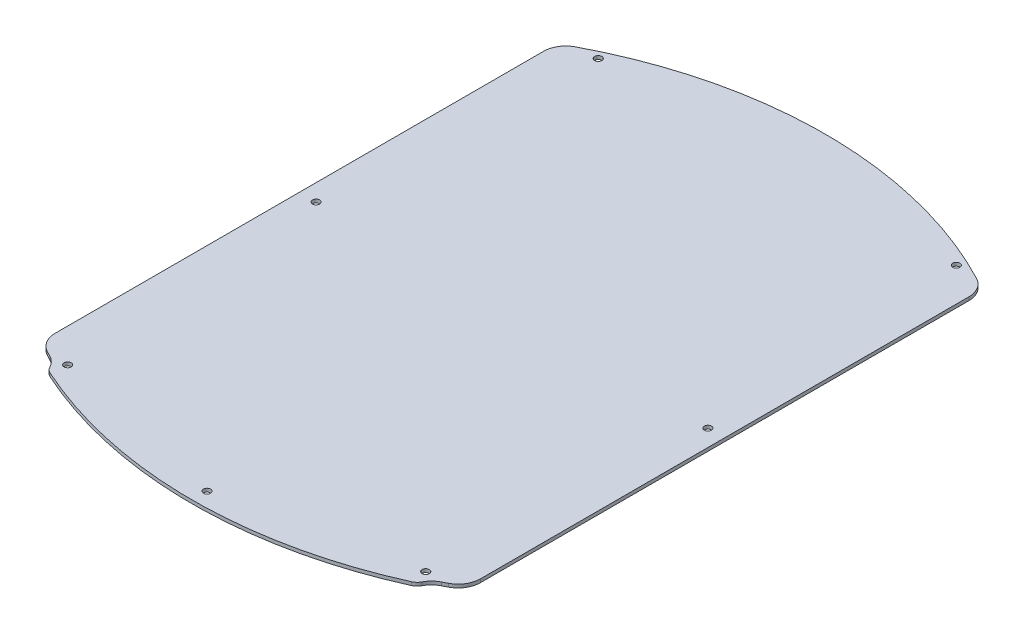
ISO-10303-21;
HEADER;
FILE_DESCRIPTION(('STEP AP214'),'2;1');
FILE_NAME('part.step','',(''),(''),'','','');
FILE_SCHEMA(('AUTOMOTIVE_DESIGN { 1 0 10303 214 1 1 1 1 }'));
ENDSEC;
DATA;
#1=APPLICATION_CONTEXT('core data for automotive mechanical design processes');
#2=APPLICATION_PROTOCOL_DEFINITION('international standard','automotive_design',2000,#1);
#3=PRODUCT_CONTEXT('',#1,'mechanical');
#4=PRODUCT('Part','Part','',(#3));
#5=PRODUCT_RELATED_PRODUCT_CATEGORY('part','',(#4));
#6=PRODUCT_DEFINITION_FORMATION('','',#4);
#7=PRODUCT_DEFINITION_CONTEXT('part definition',#1,'design');
#8=PRODUCT_DEFINITION('design','',#6,#7);
#9=PRODUCT_DEFINITION_SHAPE('','',#8);
#10=(LENGTH_UNIT() NAMED_UNIT(*) SI_UNIT(.MILLI.,.METRE.));
#11=(NAMED_UNIT(*) PLANE_ANGLE_UNIT() SI_UNIT($,.RADIAN.));
#12=(NAMED_UNIT(*) SI_UNIT($,.STERADIAN.) SOLID_ANGLE_UNIT());
#13=UNCERTAINTY_MEASURE_WITH_UNIT(LENGTH_MEASURE(1.E-05),#10,'distance_accuracy_value','');
#14=(GEOMETRIC_REPRESENTATION_CONTEXT(3) GLOBAL_UNCERTAINTY_ASSIGNED_CONTEXT((#13)) GLOBAL_UNIT_ASSIGNED_CONTEXT((#10,
#11,#12)) REPRESENTATION_CONTEXT('',''));
#15=CARTESIAN_POINT('',(0.,0.,0.));
#16=DIRECTION('',(0.,0.,1.));
#17=DIRECTION('',(1.,0.,0.));
#18=AXIS2_PLACEMENT_3D('',#15,#16,#17);
#19=CARTESIAN_POINT('',(0.,-1.5,-52.9999999999993));
#20=DIRECTION('',(0.,1.,0.));
#21=DIRECTION('',(0.,0.,1.));
#22=AXIS2_PLACEMENT_3D('',#19,#20,#21);
#23=CYLINDRICAL_SURFACE('',#22,193.);
#24=CARTESIAN_POINT('',(0.,-1.5,-52.9999999999993));
#25=DIRECTION('',(0.,1.,0.));
#26=DIRECTION('',(0.,0.,1.));
#27=AXIS2_PLACEMENT_3D('',#24,#25,#26);
#28=CIRCLE('',#27,193.);
#29=CARTESIAN_POINT('',(-89.6448087431694,-1.5,117.917548149395));
#30=VERTEX_POINT('',#29);
#31=CARTESIAN_POINT('',(-87.4520577175171,-1.5,119.049811394759));
#32=VERTEX_POINT('',#31);
#33=EDGE_CURVE('E182',#30,#32,#28,.T.);
#34=ORIENTED_EDGE('',*,*,#33,.T.);
#35=DIRECTION('',(0.,1.,0.));
#36=VECTOR('',#35,1.);
#37=CARTESIAN_POINT('',(-87.4520577175171,-1.5,119.049811394759));
#38=LINE('',#37,#36);
#39=CARTESIAN_POINT('',(-87.4520577175171,0.,119.049811394759));
#40=VERTEX_POINT('',#39);
#41=EDGE_CURVE('E208',#32,#40,#38,.T.);
#42=ORIENTED_EDGE('',*,*,#41,.T.);
#43=CARTESIAN_POINT('',(0.,0.,-52.9999999999993));
#44=DIRECTION('',(0.,1.,0.));
#45=DIRECTION('',(0.,0.,1.));
#46=AXIS2_PLACEMENT_3D('',#43,#44,#45);
#47=CIRCLE('',#46,193.);
#48=CARTESIAN_POINT('',(-89.6448087431694,0.,117.917548149395));
#49=VERTEX_POINT('',#48);
#50=EDGE_CURVE('E269',#49,#40,#47,.T.);
#51=ORIENTED_EDGE('',*,*,#50,.F.);
#52=DIRECTION('',(0.,1.,0.));
#53=VECTOR('',#52,1.);
#54=CARTESIAN_POINT('',(-89.6448087431694,-1.5,117.917548149395));
#55=LINE('',#54,#53);
#56=EDGE_CURVE('E206',#49,#30,#55,.F.);
#57=ORIENTED_EDGE('',*,*,#56,.T.);
#58=EDGE_LOOP('',(#34,#42,#51,#57));
#59=FACE_BOUND('',#58,.T.);
#60=ADVANCED_FACE('F45',(#59),#23,.T.);
#61=CARTESIAN_POINT('',(0.,-1.5,53.0000000000004));
#62=DIRECTION('',(0.,1.,0.));
#63=DIRECTION('',(0.,0.,1.));
#64=AXIS2_PLACEMENT_3D('',#61,#62,#63);
#65=CYLINDRICAL_SURFACE('',#64,193.);
#66=CARTESIAN_POINT('',(0.,-1.5,53.0000000000004));
#67=DIRECTION('',(0.,1.,0.));
#68=DIRECTION('',(0.,0.,-1.));
#69=AXIS2_PLACEMENT_3D('',#66,#67,#68);
#70=CIRCLE('',#69,193.);
#71=CARTESIAN_POINT('',(89.6448087431693,-1.5,-117.917548149394));
#72=VERTEX_POINT('',#71);
#73=CARTESIAN_POINT('',(-89.6448087431694,-1.5,-117.917548149394));
#74=VERTEX_POINT('',#73);
#75=EDGE_CURVE('E264',#72,#74,#70,.T.);
#76=ORIENTED_EDGE('',*,*,#75,.T.);
#77=DIRECTION('',(0.,1.,0.));
#78=VECTOR('',#77,1.);
#79=CARTESIAN_POINT('',(-89.6448087431695,-1.5,-117.917548149394));
#80=LINE('',#79,#78);
#81=CARTESIAN_POINT('',(-89.6448087431694,0.,-117.917548149394));
#82=VERTEX_POINT('',#81);
#83=EDGE_CURVE('E170',#74,#82,#80,.T.);
#84=ORIENTED_EDGE('',*,*,#83,.T.);
#85=CARTESIAN_POINT('',(0.,0.,53.0000000000004));
#86=DIRECTION('',(0.,1.,0.));
#87=DIRECTION('',(0.,0.,-1.));
#88=AXIS2_PLACEMENT_3D('',#85,#86,#87);
#89=CIRCLE('',#88,193.);
#90=CARTESIAN_POINT('',(89.6448087431693,0.,-117.917548149394));
#91=VERTEX_POINT('',#90);
#92=EDGE_CURVE('E153',#91,#82,#89,.T.);
#93=ORIENTED_EDGE('',*,*,#92,.F.);
#94=DIRECTION('',(0.,1.,0.));
#95=VECTOR('',#94,1.);
#96=CARTESIAN_POINT('',(89.6448087431694,-1.5,-117.917548149394));
#97=LINE('',#96,#95);
#98=EDGE_CURVE('E167',#91,#72,#97,.F.);
#99=ORIENTED_EDGE('',*,*,#98,.T.);
#100=EDGE_LOOP('',(#76,#84,#93,#99));
#101=FACE_BOUND('',#100,.T.);
#102=ADVANCED_FACE('F166',(#101),#65,.T.);
#103=CARTESIAN_POINT('',(95.,-1.5,115.));
#104=DIRECTION('',(1.,0.,0.));
#105=DIRECTION('',(0.,0.,-1.));
#106=AXIS2_PLACEMENT_3D('',#103,#104,#105);
#107=PLANE('',#106);
#108=DIRECTION('',(0.,0.,-1.));
#109=VECTOR('',#108,1.);
#110=CARTESIAN_POINT('',(95.,-1.5,115.));
#111=LINE('',#110,#109);
#112=CARTESIAN_POINT('',(95.,-1.5,109.061716639064));
#113=VERTEX_POINT('',#112);
#114=CARTESIAN_POINT('',(95.,-1.5,-109.061716639063));
#115=VERTEX_POINT('',#114);
#116=EDGE_CURVE('E177',#113,#115,#111,.T.);
#117=ORIENTED_EDGE('',*,*,#116,.T.);
#118=DIRECTION('',(0.,1.,0.));
#119=VECTOR('',#118,1.);
#120=CARTESIAN_POINT('',(95.,-1.5,-109.061716639063));
#121=LINE('',#120,#119);
#122=CARTESIAN_POINT('',(95.,0.,-109.061716639063));
#123=VERTEX_POINT('',#122);
#124=EDGE_CURVE('E204',#115,#123,#121,.T.);
#125=ORIENTED_EDGE('',*,*,#124,.T.);
#126=DIRECTION('',(0.,0.,-1.));
#127=VECTOR('',#126,1.);
#128=CARTESIAN_POINT('',(95.,0.,115.));
#129=LINE('',#128,#127);
#130=CARTESIAN_POINT('',(95.,0.,109.061716639064));
#131=VERTEX_POINT('',#130);
#132=EDGE_CURVE('E155',#131,#123,#129,.T.);
#133=ORIENTED_EDGE('',*,*,#132,.F.);
#134=DIRECTION('',(0.,1.,0.));
#135=VECTOR('',#134,1.);
#136=CARTESIAN_POINT('',(95.,-1.5,109.061716639064));
#137=LINE('',#136,#135);
#138=EDGE_CURVE('E202',#131,#113,#137,.F.);
#139=ORIENTED_EDGE('',*,*,#138,.T.);
#140=EDGE_LOOP('',(#117,#125,#133,#139));
#141=FACE_BOUND('',#140,.T.);
#142=ADVANCED_FACE('F348',(#141),#107,.T.);
#143=CARTESIAN_POINT('',(87.4520577175173,0.,119.049811394759));
#144=VERTEX_POINT('',#143);
#145=CARTESIAN_POINT('',(89.6448087431694,0.,117.917548149395));
#146=VERTEX_POINT('',#145);
#147=EDGE_CURVE('E257',#144,#146,#47,.T.);
#148=ORIENTED_EDGE('',*,*,#147,.F.);
#149=DIRECTION('',(0.,1.,0.));
#150=VECTOR('',#149,1.);
#151=CARTESIAN_POINT('',(87.4520577175173,-1.5,119.049811394759));
#152=LINE('',#151,#150);
#153=CARTESIAN_POINT('',(87.4520577175173,-1.5,119.049811394759));
#154=VERTEX_POINT('',#153);
#155=EDGE_CURVE('E214',#144,#154,#152,.F.);
#156=ORIENTED_EDGE('',*,*,#155,.T.);
#157=CARTESIAN_POINT('',(89.6448087431694,-1.5,117.917548149395));
#158=VERTEX_POINT('',#157);
#159=EDGE_CURVE('E255',#154,#158,#28,.T.);
#160=ORIENTED_EDGE('',*,*,#159,.T.);
#161=DIRECTION('',(0.,1.,0.));
#162=VECTOR('',#161,1.);
#163=CARTESIAN_POINT('',(89.6448087431694,-1.5,117.917548149395));
#164=LINE('',#163,#162);
#165=EDGE_CURVE('E211',#158,#146,#164,.T.);
#166=ORIENTED_EDGE('',*,*,#165,.T.);
#167=EDGE_LOOP('',(#148,#156,#160,#166));
#168=FACE_BOUND('',#167,.T.);
#169=ADVANCED_FACE('F254',(#168),#23,.T.);
#170=CARTESIAN_POINT('',(-95.,-1.5,115.));
#171=DIRECTION('',(-1.,0.,0.));
#172=DIRECTION('',(0.,0.,1.));
#173=AXIS2_PLACEMENT_3D('',#170,#171,#172);
#174=PLANE('',#173);
#175=DIRECTION('',(0.,0.,1.));
#176=VECTOR('',#175,1.);
#177=CARTESIAN_POINT('',(-95.,0.,115.));
#178=LINE('',#177,#176);
#179=CARTESIAN_POINT('',(-95.,0.,-109.061716639063));
#180=VERTEX_POINT('',#179);
#181=CARTESIAN_POINT('',(-95.,0.,109.061716639064));
#182=VERTEX_POINT('',#181);
#183=EDGE_CURVE('E171',#180,#182,#178,.T.);
#184=ORIENTED_EDGE('',*,*,#183,.F.);
#185=DIRECTION('',(0.,1.,0.));
#186=VECTOR('',#185,1.);
#187=CARTESIAN_POINT('',(-95.,-1.5,-109.061716639063));
#188=LINE('',#187,#186);
#189=CARTESIAN_POINT('',(-95.,-1.5,-109.061716639063));
#190=VERTEX_POINT('',#189);
#191=EDGE_CURVE('E193',#180,#190,#188,.F.);
#192=ORIENTED_EDGE('',*,*,#191,.T.);
#193=DIRECTION('',(0.,0.,1.));
#194=VECTOR('',#193,1.);
#195=CARTESIAN_POINT('',(-95.,-1.5,115.));
#196=LINE('',#195,#194);
#197=CARTESIAN_POINT('',(-95.,-1.5,109.061716639064));
#198=VERTEX_POINT('',#197);
#199=EDGE_CURVE('E260',#190,#198,#196,.T.);
#200=ORIENTED_EDGE('',*,*,#199,.T.);
#201=DIRECTION('',(0.,1.,0.));
#202=VECTOR('',#201,1.);
#203=CARTESIAN_POINT('',(-95.,-1.5,109.061716639064));
#204=LINE('',#203,#202);
#205=EDGE_CURVE('E190',#198,#182,#204,.T.);
#206=ORIENTED_EDGE('',*,*,#205,.T.);
#207=EDGE_LOOP('',(#184,#192,#200,#206));
#208=FACE_BOUND('',#207,.T.);
#209=ADVANCED_FACE('F353',(#208),#174,.T.);
#210=CARTESIAN_POINT('',(0.,-1.5,53.0000000000004));
#211=DIRECTION('',(0.,-1.,0.));
#212=DIRECTION('',(0.,0.,-1.));
#213=AXIS2_PLACEMENT_3D('',#210,#211,#212);
#214=PLANE('',#213);
#215=CARTESIAN_POINT('',(79.9805060344264,-1.5,118.518748696687));
#216=DIRECTION('',(0.,1.,0.));
#217=DIRECTION('',(0.,0.,1.));
#218=AXIS2_PLACEMENT_3D('',#215,#216,#217);
#219=CIRCLE('',#218,1.60000000000002);
#220=CARTESIAN_POINT('',(79.9805060344264,-1.5,120.118748696687));
#221=VERTEX_POINT('',#220);
#222=EDGE_CURVE('E293',#221,#221,#219,.T.);
#223=ORIENTED_EDGE('',*,*,#222,.T.);
#224=EDGE_LOOP('',(#223));
#225=FACE_BOUND('',#224,.T.);
#226=CARTESIAN_POINT('',(0.,-1.5,136.25));
#227=DIRECTION('',(0.,1.,0.));
#228=DIRECTION('',(0.,0.,1.));
#229=AXIS2_PLACEMENT_3D('',#226,#227,#228);
#230=CIRCLE('',#229,1.60000000000002);
#231=CARTESIAN_POINT('',(0.,-1.5,137.85));
#232=VERTEX_POINT('',#231);
#233=EDGE_CURVE('E300',#232,#232,#230,.T.);
#234=ORIENTED_EDGE('',*,*,#233,.T.);
#235=EDGE_LOOP('',(#234));
#236=FACE_BOUND('',#235,.T.);
#237=CARTESIAN_POINT('',(-79.9805060344263,-1.5,118.518748696687));
#238=DIRECTION('',(0.,1.,0.));
#239=DIRECTION('',(0.,0.,1.));
#240=AXIS2_PLACEMENT_3D('',#237,#238,#239);
#241=CIRCLE('',#240,1.60000000000002);
#242=CARTESIAN_POINT('',(-79.9805060344263,-1.5,120.118748696687));
#243=VERTEX_POINT('',#242);
#244=EDGE_CURVE('E281',#243,#243,#241,.T.);
#245=ORIENTED_EDGE('',*,*,#244,.T.);
#246=EDGE_LOOP('',(#245));
#247=FACE_BOUND('',#246,.T.);
#248=CARTESIAN_POINT('',(79.9805060344263,-1.5,-118.518748696687));
#249=DIRECTION('',(0.,1.,0.));
#250=DIRECTION('',(0.,0.,1.));
#251=AXIS2_PLACEMENT_3D('',#248,#249,#250);
#252=CIRCLE('',#251,1.60000000000002);
#253=CARTESIAN_POINT('',(79.9805060344263,-1.5,-116.918748696686));
#254=VERTEX_POINT('',#253);
#255=EDGE_CURVE('E288',#254,#254,#252,.T.);
#256=ORIENTED_EDGE('',*,*,#255,.T.);
#257=EDGE_LOOP('',(#256));
#258=FACE_BOUND('',#257,.T.);
#259=CARTESIAN_POINT('',(87.5000000000009,-1.5,0.));
#260=DIRECTION('',(0.,1.,0.));
#261=DIRECTION('',(0.,0.,1.));
#262=AXIS2_PLACEMENT_3D('',#259,#260,#261);
#263=CIRCLE('',#262,1.60000000000001);
#264=CARTESIAN_POINT('',(87.5000000000009,-1.5,1.60000000000001));
#265=VERTEX_POINT('',#264);
#266=EDGE_CURVE('E311',#265,#265,#263,.T.);
#267=ORIENTED_EDGE('',*,*,#266,.T.);
#268=EDGE_LOOP('',(#267));
#269=FACE_BOUND('',#268,.T.);
#270=CARTESIAN_POINT('',(-87.5000000000001,-1.5,0.));
#271=DIRECTION('',(0.,1.,0.));
#272=DIRECTION('',(0.,0.,1.));
#273=AXIS2_PLACEMENT_3D('',#270,#271,#272);
#274=CIRCLE('',#273,1.60000000000001);
#275=CARTESIAN_POINT('',(-87.5000000000001,-1.5,1.60000000000001));
#276=VERTEX_POINT('',#275);
#277=EDGE_CURVE('E305',#276,#276,#274,.T.);
#278=ORIENTED_EDGE('',*,*,#277,.T.);
#279=EDGE_LOOP('',(#278));
#280=FACE_BOUND('',#279,.T.);
#281=CARTESIAN_POINT('',(-79.9805060344263,-1.5,-118.518748696687));
#282=DIRECTION('',(0.,1.,0.));
#283=DIRECTION('',(0.,0.,1.));
#284=AXIS2_PLACEMENT_3D('',#281,#282,#283);
#285=CIRCLE('',#284,1.60000000000002);
#286=CARTESIAN_POINT('',(-79.9805060344263,-1.5,-116.918748696686));
#287=VERTEX_POINT('',#286);
#288=EDGE_CURVE('E273',#287,#287,#285,.T.);
#289=ORIENTED_EDGE('',*,*,#288,.T.);
#290=EDGE_LOOP('',(#289));
#291=FACE_BOUND('',#290,.T.);
#292=CARTESIAN_POINT('',(91.9832524179068,-1.5,127.964309394488));
#293=DIRECTION('',(0.,-1.,0.));
#294=DIRECTION('',(0.,0.,-1.));
#295=AXIS2_PLACEMENT_3D('',#292,#293,#294);
#296=CIRCLE('',#295,10.);
#297=CARTESIAN_POINT('',(83.1111833700703,-1.5,123.35059171669));
#298=VERTEX_POINT('',#297);
#299=EDGE_CURVE('E223',#154,#298,#296,.F.);
#300=ORIENTED_EDGE('',*,*,#299,.T.);
#301=CARTESIAN_POINT('',(78.6751488461518,-1.5,121.043732877791));
#302=DIRECTION('',(0.,-1.,0.));
#303=DIRECTION('',(0.,0.,-1.));
#304=AXIS2_PLACEMENT_3D('',#301,#302,#303);
#305=CIRCLE('',#304,5.);
#306=CARTESIAN_POINT('',(80.7347077164699,-1.5,125.599851539514));
#307=VERTEX_POINT('',#306);
#308=EDGE_CURVE('E53',#298,#307,#305,.T.);
#309=ORIENTED_EDGE('',*,*,#308,.T.);
#310=CARTESIAN_POINT('',(0.,-1.5,-52.9999999999993));
#311=DIRECTION('',(0.,1.,0.));
#312=DIRECTION('',(0.,0.,1.));
#313=AXIS2_PLACEMENT_3D('',#310,#311,#312);
#314=CIRCLE('',#313,196.);
#315=CARTESIAN_POINT('',(-80.7347077164699,-1.5,125.599851539514));
#316=VERTEX_POINT('',#315);
#317=EDGE_CURVE('E172',#316,#307,#314,.T.);
#318=ORIENTED_EDGE('',*,*,#317,.F.);
#319=CARTESIAN_POINT('',(-78.6751488461518,-1.5,121.043732877791));
#320=DIRECTION('',(0.,-1.,0.));
#321=DIRECTION('',(0.,0.,-1.));
#322=AXIS2_PLACEMENT_3D('',#319,#320,#321);
#323=CIRCLE('',#322,5.);
#324=CARTESIAN_POINT('',(-83.1111833700701,-1.5,123.35059171669));
#325=VERTEX_POINT('',#324);
#326=EDGE_CURVE('E60',#316,#325,#323,.T.);
#327=ORIENTED_EDGE('',*,*,#326,.T.);
#328=CARTESIAN_POINT('',(-91.9832524179066,-1.5,127.964309394488));
#329=DIRECTION('',(0.,-1.,0.));
#330=DIRECTION('',(0.,0.,-1.));
#331=AXIS2_PLACEMENT_3D('',#328,#329,#330);
#332=CIRCLE('',#331,10.);
#333=EDGE_CURVE('E219',#325,#32,#332,.F.);
#334=ORIENTED_EDGE('',*,*,#333,.T.);
#335=ORIENTED_EDGE('',*,*,#33,.F.);
#336=CARTESIAN_POINT('',(-85.,-1.5,109.061716639064));
#337=DIRECTION('',(0.,-1.,0.));
#338=DIRECTION('',(0.,0.,-1.));
#339=AXIS2_PLACEMENT_3D('',#336,#337,#338);
#340=CIRCLE('',#339,10.);
#341=EDGE_CURVE('E197',#30,#198,#340,.T.);
#342=ORIENTED_EDGE('',*,*,#341,.T.);
#343=ORIENTED_EDGE('',*,*,#199,.F.);
#344=CARTESIAN_POINT('',(-85.,-1.5,-109.061716639063));
#345=DIRECTION('',(0.,-1.,0.));
#346=DIRECTION('',(0.,0.,-1.));
#347=AXIS2_PLACEMENT_3D('',#344,#345,#346);
#348=CIRCLE('',#347,10.);
#349=EDGE_CURVE('E200',#190,#74,#348,.T.);
#350=ORIENTED_EDGE('',*,*,#349,.T.);
#351=ORIENTED_EDGE('',*,*,#75,.F.);
#352=CARTESIAN_POINT('',(85.,-1.5,-109.061716639063));
#353=DIRECTION('',(0.,-1.,0.));
#354=DIRECTION('',(0.,0.,-1.));
#355=AXIS2_PLACEMENT_3D('',#352,#353,#354);
#356=CIRCLE('',#355,10.);
#357=EDGE_CURVE('E176',#72,#115,#356,.T.);
#358=ORIENTED_EDGE('',*,*,#357,.T.);
#359=ORIENTED_EDGE('',*,*,#116,.F.);
#360=CARTESIAN_POINT('',(85.,-1.5,109.061716639064));
#361=DIRECTION('',(0.,-1.,0.));
#362=DIRECTION('',(0.,0.,-1.));
#363=AXIS2_PLACEMENT_3D('',#360,#361,#362);
#364=CIRCLE('',#363,10.);
#365=EDGE_CURVE('E195',#113,#158,#364,.T.);
#366=ORIENTED_EDGE('',*,*,#365,.T.);
#367=ORIENTED_EDGE('',*,*,#159,.F.);
#368=EDGE_LOOP('',(#300,#309,#318,#327,#334,#335,#342,#343,#350,#351,#358,#359,#366,#367));
#369=FACE_BOUND('',#368,.T.);
#370=ADVANCED_FACE('F237',(#225,#236,#247,#258,#269,#280,#291,#369),#214,.T.);
#371=CARTESIAN_POINT('',(0.,0.,53.0000000000004));
#372=DIRECTION('',(0.,-1.,0.));
#373=DIRECTION('',(0.,0.,-1.));
#374=AXIS2_PLACEMENT_3D('',#371,#372,#373);
#375=PLANE('',#374);
#376=CARTESIAN_POINT('',(79.9805060344264,0.,118.518748696687));
#377=DIRECTION('',(0.,1.,0.));
#378=DIRECTION('',(0.,0.,1.));
#379=AXIS2_PLACEMENT_3D('',#376,#377,#378);
#380=CIRCLE('',#379,1.60000000000002);
#381=CARTESIAN_POINT('',(79.9805060344264,0.,120.118748696687));
#382=VERTEX_POINT('',#381);
#383=EDGE_CURVE('E296',#382,#382,#380,.T.);
#384=ORIENTED_EDGE('',*,*,#383,.F.);
#385=EDGE_LOOP('',(#384));
#386=FACE_BOUND('',#385,.T.);
#387=CARTESIAN_POINT('',(0.,0.,136.25));
#388=DIRECTION('',(0.,1.,0.));
#389=DIRECTION('',(0.,0.,1.));
#390=AXIS2_PLACEMENT_3D('',#387,#388,#389);
#391=CIRCLE('',#390,1.60000000000002);
#392=CARTESIAN_POINT('',(0.,0.,137.85));
#393=VERTEX_POINT('',#392);
#394=EDGE_CURVE('E285',#393,#393,#391,.T.);
#395=ORIENTED_EDGE('',*,*,#394,.F.);
#396=EDGE_LOOP('',(#395));
#397=FACE_BOUND('',#396,.T.);
#398=CARTESIAN_POINT('',(-79.9805060344263,0.,118.518748696687));
#399=DIRECTION('',(0.,1.,0.));
#400=DIRECTION('',(0.,0.,1.));
#401=AXIS2_PLACEMENT_3D('',#398,#399,#400);
#402=CIRCLE('',#401,1.60000000000002);
#403=CARTESIAN_POINT('',(-79.9805060344263,0.,120.118748696687));
#404=VERTEX_POINT('',#403);
#405=EDGE_CURVE('E284',#404,#404,#402,.T.);
#406=ORIENTED_EDGE('',*,*,#405,.F.);
#407=EDGE_LOOP('',(#406));
#408=FACE_BOUND('',#407,.T.);
#409=CARTESIAN_POINT('',(79.9805060344263,0.,-118.518748696687));
#410=DIRECTION('',(0.,1.,0.));
#411=DIRECTION('',(0.,0.,1.));
#412=AXIS2_PLACEMENT_3D('',#409,#410,#411);
#413=CIRCLE('',#412,1.60000000000002);
#414=CARTESIAN_POINT('',(79.9805060344263,0.,-116.918748696686));
#415=VERTEX_POINT('',#414);
#416=EDGE_CURVE('E278',#415,#415,#413,.T.);
#417=ORIENTED_EDGE('',*,*,#416,.F.);
#418=EDGE_LOOP('',(#417));
#419=FACE_BOUND('',#418,.T.);
#420=CARTESIAN_POINT('',(87.5000000000009,0.,0.));
#421=DIRECTION('',(0.,1.,0.));
#422=DIRECTION('',(0.,0.,1.));
#423=AXIS2_PLACEMENT_3D('',#420,#421,#422);
#424=CIRCLE('',#423,1.60000000000001);
#425=CARTESIAN_POINT('',(87.5000000000009,0.,1.60000000000001));
#426=VERTEX_POINT('',#425);
#427=EDGE_CURVE('E297',#426,#426,#424,.T.);
#428=ORIENTED_EDGE('',*,*,#427,.F.);
#429=EDGE_LOOP('',(#428));
#430=FACE_BOUND('',#429,.T.);
#431=CARTESIAN_POINT('',(-87.5000000000001,0.,0.));
#432=DIRECTION('',(0.,1.,0.));
#433=DIRECTION('',(0.,0.,1.));
#434=AXIS2_PLACEMENT_3D('',#431,#432,#433);
#435=CIRCLE('',#434,1.60000000000001);
#436=CARTESIAN_POINT('',(-87.5000000000001,0.,1.60000000000001));
#437=VERTEX_POINT('',#436);
#438=EDGE_CURVE('E308',#437,#437,#435,.T.);
#439=ORIENTED_EDGE('',*,*,#438,.F.);
#440=EDGE_LOOP('',(#439));
#441=FACE_BOUND('',#440,.T.);
#442=CARTESIAN_POINT('',(-79.9805060344263,0.,-118.518748696687));
#443=DIRECTION('',(0.,1.,0.));
#444=DIRECTION('',(0.,0.,1.));
#445=AXIS2_PLACEMENT_3D('',#442,#443,#444);
#446=CIRCLE('',#445,1.60000000000002);
#447=CARTESIAN_POINT('',(-79.9805060344263,0.,-116.918748696686));
#448=VERTEX_POINT('',#447);
#449=EDGE_CURVE('E275',#448,#448,#446,.T.);
#450=ORIENTED_EDGE('',*,*,#449,.F.);
#451=EDGE_LOOP('',(#450));
#452=FACE_BOUND('',#451,.T.);
#453=CARTESIAN_POINT('',(0.,0.,-52.9999999999993));
#454=DIRECTION('',(0.,1.,0.));
#455=DIRECTION('',(0.,0.,1.));
#456=AXIS2_PLACEMENT_3D('',#453,#454,#455);
#457=CIRCLE('',#456,196.);
#458=CARTESIAN_POINT('',(-80.7347077164699,0.,125.599851539514));
#459=VERTEX_POINT('',#458);
#460=CARTESIAN_POINT('',(80.7347077164699,0.,125.599851539514));
#461=VERTEX_POINT('',#460);
#462=EDGE_CURVE('E245',#459,#461,#457,.T.);
#463=ORIENTED_EDGE('',*,*,#462,.T.);
#464=CARTESIAN_POINT('',(78.6751488461518,0.,121.043732877791));
#465=DIRECTION('',(0.,-1.,0.));
#466=DIRECTION('',(0.,0.,-1.));
#467=AXIS2_PLACEMENT_3D('',#464,#465,#466);
#468=CIRCLE('',#467,5.);
#469=CARTESIAN_POINT('',(83.1111833700703,0.,123.35059171669));
#470=VERTEX_POINT('',#469);
#471=EDGE_CURVE('E232',#461,#470,#468,.F.);
#472=ORIENTED_EDGE('',*,*,#471,.T.);
#473=CARTESIAN_POINT('',(91.9832524179068,0.,127.964309394488));
#474=DIRECTION('',(0.,-1.,0.));
#475=DIRECTION('',(0.,0.,-1.));
#476=AXIS2_PLACEMENT_3D('',#473,#474,#475);
#477=CIRCLE('',#476,10.);
#478=EDGE_CURVE('E221',#470,#144,#477,.T.);
#479=ORIENTED_EDGE('',*,*,#478,.T.);
#480=ORIENTED_EDGE('',*,*,#147,.T.);
#481=CARTESIAN_POINT('',(85.,0.,109.061716639064));
#482=DIRECTION('',(0.,-1.,0.));
#483=DIRECTION('',(0.,0.,-1.));
#484=AXIS2_PLACEMENT_3D('',#481,#482,#483);
#485=CIRCLE('',#484,10.);
#486=EDGE_CURVE('E179',#146,#131,#485,.F.);
#487=ORIENTED_EDGE('',*,*,#486,.T.);
#488=ORIENTED_EDGE('',*,*,#132,.T.);
#489=CARTESIAN_POINT('',(85.,0.,-109.061716639063));
#490=DIRECTION('',(0.,-1.,0.));
#491=DIRECTION('',(0.,0.,-1.));
#492=AXIS2_PLACEMENT_3D('',#489,#490,#491);
#493=CIRCLE('',#492,10.);
#494=EDGE_CURVE('E149',#123,#91,#493,.F.);
#495=ORIENTED_EDGE('',*,*,#494,.T.);
#496=ORIENTED_EDGE('',*,*,#92,.T.);
#497=CARTESIAN_POINT('',(-85.,0.,-109.061716639063));
#498=DIRECTION('',(0.,-1.,0.));
#499=DIRECTION('',(0.,0.,-1.));
#500=AXIS2_PLACEMENT_3D('',#497,#498,#499);
#501=CIRCLE('',#500,10.);
#502=EDGE_CURVE('E160',#82,#180,#501,.F.);
#503=ORIENTED_EDGE('',*,*,#502,.T.);
#504=ORIENTED_EDGE('',*,*,#183,.T.);
#505=CARTESIAN_POINT('',(-85.,0.,109.061716639064));
#506=DIRECTION('',(0.,-1.,0.));
#507=DIRECTION('',(0.,0.,-1.));
#508=AXIS2_PLACEMENT_3D('',#505,#506,#507);
#509=CIRCLE('',#508,10.);
#510=EDGE_CURVE('E161',#182,#49,#509,.F.);
#511=ORIENTED_EDGE('',*,*,#510,.T.);
#512=ORIENTED_EDGE('',*,*,#50,.T.);
#513=CARTESIAN_POINT('',(-91.9832524179066,0.,127.964309394488));
#514=DIRECTION('',(0.,-1.,0.));
#515=DIRECTION('',(0.,0.,-1.));
#516=AXIS2_PLACEMENT_3D('',#513,#514,#515);
#517=CIRCLE('',#516,10.);
#518=CARTESIAN_POINT('',(-83.1111833700701,0.,123.35059171669));
#519=VERTEX_POINT('',#518);
#520=EDGE_CURVE('E216',#40,#519,#517,.T.);
#521=ORIENTED_EDGE('',*,*,#520,.T.);
#522=CARTESIAN_POINT('',(-78.6751488461518,0.,121.043732877791));
#523=DIRECTION('',(0.,-1.,0.));
#524=DIRECTION('',(0.,0.,-1.));
#525=AXIS2_PLACEMENT_3D('',#522,#523,#524);
#526=CIRCLE('',#525,5.);
#527=EDGE_CURVE('E230',#519,#459,#526,.F.);
#528=ORIENTED_EDGE('',*,*,#527,.T.);
#529=EDGE_LOOP('',(#463,#472,#479,#480,#487,#488,#495,#496,#503,#504,#511,#512,#521,#528));
#530=FACE_BOUND('',#529,.T.);
#531=ADVANCED_FACE('F152',(#386,#397,#408,#419,#430,#441,#452,#530),#375,.F.);
#532=CARTESIAN_POINT('',(0.,-1.5,-52.9999999999993));
#533=DIRECTION('',(0.,1.,0.));
#534=DIRECTION('',(0.,0.,1.));
#535=AXIS2_PLACEMENT_3D('',#532,#533,#534);
#536=CYLINDRICAL_SURFACE('',#535,196.);
#537=ORIENTED_EDGE('',*,*,#317,.T.);
#538=DIRECTION('',(0.,1.,0.));
#539=VECTOR('',#538,1.);
#540=CARTESIAN_POINT('',(80.7347077164699,-1.5,125.599851539514));
#541=LINE('',#540,#539);
#542=EDGE_CURVE('E227',#307,#461,#541,.T.);
#543=ORIENTED_EDGE('',*,*,#542,.T.);
#544=ORIENTED_EDGE('',*,*,#462,.F.);
#545=DIRECTION('',(0.,1.,0.));
#546=VECTOR('',#545,1.);
#547=CARTESIAN_POINT('',(-80.7347077164699,-1.5,125.599851539514));
#548=LINE('',#547,#546);
#549=EDGE_CURVE('E225',#459,#316,#548,.F.);
#550=ORIENTED_EDGE('',*,*,#549,.T.);
#551=EDGE_LOOP('',(#537,#543,#544,#550));
#552=FACE_BOUND('',#551,.T.);
#553=ADVANCED_FACE('F242',(#552),#536,.T.);
#554=CARTESIAN_POINT('',(-85.,-1.5,-109.061716639063));
#555=DIRECTION('',(0.,1.,0.));
#556=DIRECTION('',(0.,0.,1.));
#557=AXIS2_PLACEMENT_3D('',#554,#555,#556);
#558=CYLINDRICAL_SURFACE('',#557,10.);
#559=ORIENTED_EDGE('',*,*,#349,.F.);
#560=ORIENTED_EDGE('',*,*,#191,.F.);
#561=ORIENTED_EDGE('',*,*,#502,.F.);
#562=ORIENTED_EDGE('',*,*,#83,.F.);
#563=EDGE_LOOP('',(#559,#560,#561,#562));
#564=FACE_BOUND('',#563,.T.);
#565=ADVANCED_FACE('F366',(#564),#558,.T.);
#566=CARTESIAN_POINT('',(85.,-1.5,-109.061716639063));
#567=DIRECTION('',(0.,1.,0.));
#568=DIRECTION('',(0.,0.,1.));
#569=AXIS2_PLACEMENT_3D('',#566,#567,#568);
#570=CYLINDRICAL_SURFACE('',#569,10.);
#571=ORIENTED_EDGE('',*,*,#357,.F.);
#572=ORIENTED_EDGE('',*,*,#98,.F.);
#573=ORIENTED_EDGE('',*,*,#494,.F.);
#574=ORIENTED_EDGE('',*,*,#124,.F.);
#575=EDGE_LOOP('',(#571,#572,#573,#574));
#576=FACE_BOUND('',#575,.T.);
#577=ADVANCED_FACE('F175',(#576),#570,.T.);
#578=CARTESIAN_POINT('',(-91.9832524179066,-1.5,127.964309394488));
#579=DIRECTION('',(0.,-1.,0.));
#580=DIRECTION('',(0.,0.,-1.));
#581=AXIS2_PLACEMENT_3D('',#578,#579,#580);
#582=CYLINDRICAL_SURFACE('',#581,10.);
#583=ORIENTED_EDGE('',*,*,#333,.F.);
#584=DIRECTION('',(0.,-1.,0.));
#585=VECTOR('',#584,1.);
#586=CARTESIAN_POINT('',(-83.1111833700701,-1.5,123.35059171669));
#587=LINE('',#586,#585);
#588=EDGE_CURVE('E11',#325,#519,#587,.F.);
#589=ORIENTED_EDGE('',*,*,#588,.T.);
#590=ORIENTED_EDGE('',*,*,#520,.F.);
#591=ORIENTED_EDGE('',*,*,#41,.F.);
#592=EDGE_LOOP('',(#583,#589,#590,#591));
#593=FACE_BOUND('',#592,.T.);
#594=ADVANCED_FACE('F377',(#593),#582,.F.);
#595=CARTESIAN_POINT('',(91.9832524179068,-1.5,127.964309394488));
#596=DIRECTION('',(0.,-1.,0.));
#597=DIRECTION('',(0.,0.,-1.));
#598=AXIS2_PLACEMENT_3D('',#595,#596,#597);
#599=CYLINDRICAL_SURFACE('',#598,10.);
#600=ORIENTED_EDGE('',*,*,#478,.F.);
#601=DIRECTION('',(0.,-1.,0.));
#602=VECTOR('',#601,1.);
#603=CARTESIAN_POINT('',(83.1111833700703,-1.5,123.35059171669));
#604=LINE('',#603,#602);
#605=EDGE_CURVE('E68',#470,#298,#604,.T.);
#606=ORIENTED_EDGE('',*,*,#605,.T.);
#607=ORIENTED_EDGE('',*,*,#299,.F.);
#608=ORIENTED_EDGE('',*,*,#155,.F.);
#609=EDGE_LOOP('',(#600,#606,#607,#608));
#610=FACE_BOUND('',#609,.T.);
#611=ADVANCED_FACE('F251',(#610),#599,.F.);
#612=CARTESIAN_POINT('',(-85.,-1.5,109.061716639064));
#613=DIRECTION('',(0.,1.,0.));
#614=DIRECTION('',(0.,0.,1.));
#615=AXIS2_PLACEMENT_3D('',#612,#613,#614);
#616=CYLINDRICAL_SURFACE('',#615,10.);
#617=ORIENTED_EDGE('',*,*,#341,.F.);
#618=ORIENTED_EDGE('',*,*,#56,.F.);
#619=ORIENTED_EDGE('',*,*,#510,.F.);
#620=ORIENTED_EDGE('',*,*,#205,.F.);
#621=EDGE_LOOP('',(#617,#618,#619,#620));
#622=FACE_BOUND('',#621,.T.);
#623=ADVANCED_FACE('F385',(#622),#616,.T.);
#624=CARTESIAN_POINT('',(85.,-1.5,109.061716639064));
#625=DIRECTION('',(0.,1.,0.));
#626=DIRECTION('',(0.,0.,1.));
#627=AXIS2_PLACEMENT_3D('',#624,#625,#626);
#628=CYLINDRICAL_SURFACE('',#627,10.);
#629=ORIENTED_EDGE('',*,*,#365,.F.);
#630=ORIENTED_EDGE('',*,*,#138,.F.);
#631=ORIENTED_EDGE('',*,*,#486,.F.);
#632=ORIENTED_EDGE('',*,*,#165,.F.);
#633=EDGE_LOOP('',(#629,#630,#631,#632));
#634=FACE_BOUND('',#633,.T.);
#635=ADVANCED_FACE('F388',(#634),#628,.T.);
#636=CARTESIAN_POINT('',(78.6751488461518,-1.5,121.043732877791));
#637=DIRECTION('',(0.,-1.,0.));
#638=DIRECTION('',(0.,0.,-1.));
#639=AXIS2_PLACEMENT_3D('',#636,#637,#638);
#640=CYLINDRICAL_SURFACE('',#639,5.);
#641=ORIENTED_EDGE('',*,*,#308,.F.);
#642=ORIENTED_EDGE('',*,*,#605,.F.);
#643=ORIENTED_EDGE('',*,*,#471,.F.);
#644=ORIENTED_EDGE('',*,*,#542,.F.);
#645=EDGE_LOOP('',(#641,#642,#643,#644));
#646=FACE_BOUND('',#645,.T.);
#647=ADVANCED_FACE('F247',(#646),#640,.T.);
#648=CARTESIAN_POINT('',(-78.6751488461518,-1.5,121.043732877791));
#649=DIRECTION('',(0.,-1.,0.));
#650=DIRECTION('',(0.,0.,-1.));
#651=AXIS2_PLACEMENT_3D('',#648,#649,#650);
#652=CYLINDRICAL_SURFACE('',#651,5.);
#653=ORIENTED_EDGE('',*,*,#326,.F.);
#654=ORIENTED_EDGE('',*,*,#549,.F.);
#655=ORIENTED_EDGE('',*,*,#527,.F.);
#656=ORIENTED_EDGE('',*,*,#588,.F.);
#657=EDGE_LOOP('',(#653,#654,#655,#656));
#658=FACE_BOUND('',#657,.T.);
#659=ADVANCED_FACE('F47',(#658),#652,.T.);
#660=CARTESIAN_POINT('',(-79.9805060344263,-1.5,-118.518748696687));
#661=DIRECTION('',(0.,1.,0.));
#662=DIRECTION('',(0.,0.,1.));
#663=AXIS2_PLACEMENT_3D('',#660,#661,#662);
#664=CYLINDRICAL_SURFACE('',#663,1.60000000000002);
#665=ORIENTED_EDGE('',*,*,#288,.F.);
#666=EDGE_LOOP('',(#665));
#667=FACE_BOUND('',#666,.T.);
#668=ORIENTED_EDGE('',*,*,#449,.T.);
#669=EDGE_LOOP('',(#668));
#670=FACE_BOUND('',#669,.T.);
#671=ADVANCED_FACE('F327',(#667,#670),#664,.F.);
#672=CARTESIAN_POINT('',(-87.5000000000001,-1.5,0.));
#673=DIRECTION('',(0.,1.,0.));
#674=DIRECTION('',(0.,0.,1.));
#675=AXIS2_PLACEMENT_3D('',#672,#673,#674);
#676=CYLINDRICAL_SURFACE('',#675,1.60000000000001);
#677=ORIENTED_EDGE('',*,*,#277,.F.);
#678=EDGE_LOOP('',(#677));
#679=FACE_BOUND('',#678,.T.);
#680=ORIENTED_EDGE('',*,*,#438,.T.);
#681=EDGE_LOOP('',(#680));
#682=FACE_BOUND('',#681,.T.);
#683=ADVANCED_FACE('F329',(#679,#682),#676,.F.);
#684=CARTESIAN_POINT('',(87.5000000000009,-1.5,0.));
#685=DIRECTION('',(0.,1.,0.));
#686=DIRECTION('',(0.,0.,1.));
#687=AXIS2_PLACEMENT_3D('',#684,#685,#686);
#688=CYLINDRICAL_SURFACE('',#687,1.60000000000001);
#689=ORIENTED_EDGE('',*,*,#266,.F.);
#690=EDGE_LOOP('',(#689));
#691=FACE_BOUND('',#690,.T.);
#692=ORIENTED_EDGE('',*,*,#427,.T.);
#693=EDGE_LOOP('',(#692));
#694=FACE_BOUND('',#693,.T.);
#695=ADVANCED_FACE('F317',(#691,#694),#688,.F.);
#696=CARTESIAN_POINT('',(79.9805060344263,-1.5,-118.518748696687));
#697=DIRECTION('',(0.,1.,0.));
#698=DIRECTION('',(0.,0.,1.));
#699=AXIS2_PLACEMENT_3D('',#696,#697,#698);
#700=CYLINDRICAL_SURFACE('',#699,1.60000000000002);
#701=ORIENTED_EDGE('',*,*,#255,.F.);
#702=EDGE_LOOP('',(#701));
#703=FACE_BOUND('',#702,.T.);
#704=ORIENTED_EDGE('',*,*,#416,.T.);
#705=EDGE_LOOP('',(#704));
#706=FACE_BOUND('',#705,.T.);
#707=ADVANCED_FACE('F477',(#703,#706),#700,.F.);
#708=CARTESIAN_POINT('',(-79.9805060344263,-1.5,118.518748696687));
#709=DIRECTION('',(0.,1.,0.));
#710=DIRECTION('',(0.,0.,1.));
#711=AXIS2_PLACEMENT_3D('',#708,#709,#710);
#712=CYLINDRICAL_SURFACE('',#711,1.60000000000002);
#713=ORIENTED_EDGE('',*,*,#244,.F.);
#714=EDGE_LOOP('',(#713));
#715=FACE_BOUND('',#714,.T.);
#716=ORIENTED_EDGE('',*,*,#405,.T.);
#717=EDGE_LOOP('',(#716));
#718=FACE_BOUND('',#717,.T.);
#719=ADVANCED_FACE('F488',(#715,#718),#712,.F.);
#720=CARTESIAN_POINT('',(0.,-1.5,136.25));
#721=DIRECTION('',(0.,1.,0.));
#722=DIRECTION('',(0.,0.,1.));
#723=AXIS2_PLACEMENT_3D('',#720,#721,#722);
#724=CYLINDRICAL_SURFACE('',#723,1.60000000000002);
#725=ORIENTED_EDGE('',*,*,#233,.F.);
#726=EDGE_LOOP('',(#725));
#727=FACE_BOUND('',#726,.T.);
#728=ORIENTED_EDGE('',*,*,#394,.T.);
#729=EDGE_LOOP('',(#728));
#730=FACE_BOUND('',#729,.T.);
#731=ADVANCED_FACE('F499',(#727,#730),#724,.F.);
#732=CARTESIAN_POINT('',(79.9805060344264,-1.5,118.518748696687));
#733=DIRECTION('',(0.,1.,0.));
#734=DIRECTION('',(0.,0.,1.));
#735=AXIS2_PLACEMENT_3D('',#732,#733,#734);
#736=CYLINDRICAL_SURFACE('',#735,1.60000000000002);
#737=ORIENTED_EDGE('',*,*,#222,.F.);
#738=EDGE_LOOP('',(#737));
#739=FACE_BOUND('',#738,.T.);
#740=ORIENTED_EDGE('',*,*,#383,.T.);
#741=EDGE_LOOP('',(#740));
#742=FACE_BOUND('',#741,.T.);
#743=ADVANCED_FACE('F509',(#739,#742),#736,.F.);
#744=CLOSED_SHELL('',(#60,#102,#142,#169,#209,#370,#531,#553,#565,#577,#594,#611,#623,#635,#647,
#659,#671,#683,#695,#707,#719,#731,#743));
#745=MANIFOLD_SOLID_BREP('B2',#744);
#746=ADVANCED_BREP_SHAPE_REPRESENTATION('',(#18,#745),#14);
#747=SHAPE_DEFINITION_REPRESENTATION(#9,#746);
ENDSEC;
END-ISO-10303-21;
